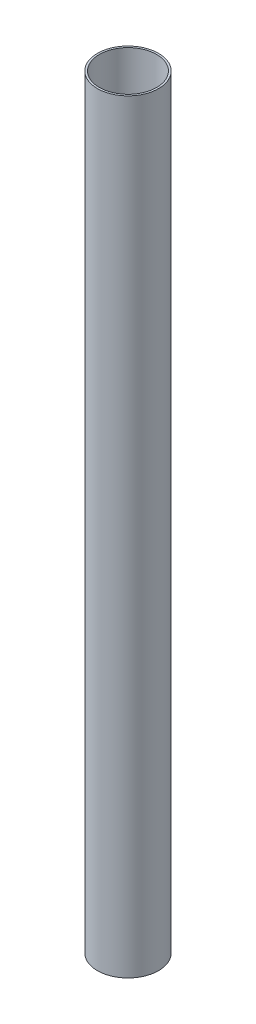
ISO-10303-21;
HEADER;
FILE_DESCRIPTION(('STEP AP214'),'2;1');
FILE_NAME('part.step','',(''),(''),'','','');
FILE_SCHEMA(('AUTOMOTIVE_DESIGN { 1 0 10303 214 1 1 1 1 }'));
ENDSEC;
DATA;
#1=APPLICATION_CONTEXT('core data for automotive mechanical design processes');
#2=APPLICATION_PROTOCOL_DEFINITION('international standard','automotive_design',2000,#1);
#3=PRODUCT_CONTEXT('',#1,'mechanical');
#4=PRODUCT('Part','Part','',(#3));
#5=PRODUCT_RELATED_PRODUCT_CATEGORY('part','',(#4));
#6=PRODUCT_DEFINITION_FORMATION('','',#4);
#7=PRODUCT_DEFINITION_CONTEXT('part definition',#1,'design');
#8=PRODUCT_DEFINITION('design','',#6,#7);
#9=PRODUCT_DEFINITION_SHAPE('','',#8);
#10=(LENGTH_UNIT() NAMED_UNIT(*) SI_UNIT(.MILLI.,.METRE.));
#11=(NAMED_UNIT(*) PLANE_ANGLE_UNIT() SI_UNIT($,.RADIAN.));
#12=(NAMED_UNIT(*) SI_UNIT($,.STERADIAN.) SOLID_ANGLE_UNIT());
#13=UNCERTAINTY_MEASURE_WITH_UNIT(LENGTH_MEASURE(1.E-05),#10,'distance_accuracy_value','');
#14=(GEOMETRIC_REPRESENTATION_CONTEXT(3) GLOBAL_UNCERTAINTY_ASSIGNED_CONTEXT((#13)) GLOBAL_UNIT_ASSIGNED_CONTEXT((#10,
#11,#12)) REPRESENTATION_CONTEXT('',''));
#15=CARTESIAN_POINT('',(0.,0.,0.));
#16=DIRECTION('',(0.,0.,1.));
#17=DIRECTION('',(1.,0.,0.));
#18=AXIS2_PLACEMENT_3D('',#15,#16,#17);
#19=CARTESIAN_POINT('',(0.,200.,0.));
#20=DIRECTION('',(0.,1.,0.));
#21=DIRECTION('',(0.,0.,1.));
#22=AXIS2_PLACEMENT_3D('',#19,#20,#21);
#23=PLANE('',#22);
#24=CARTESIAN_POINT('',(0.,200.,0.));
#25=DIRECTION('',(0.,1.,0.));
#26=DIRECTION('',(0.,0.,1.));
#27=AXIS2_PLACEMENT_3D('',#24,#25,#26);
#28=CIRCLE('',#27,8.);
#29=CARTESIAN_POINT('',(0.,200.,8.));
#30=VERTEX_POINT('',#29);
#31=EDGE_CURVE('E10',#30,#30,#28,.T.);
#32=ORIENTED_EDGE('',*,*,#31,.T.);
#33=EDGE_LOOP('',(#32));
#34=FACE_BOUND('',#33,.T.);
#35=CARTESIAN_POINT('',(0.,200.,0.));
#36=DIRECTION('',(0.,1.,0.));
#37=DIRECTION('',(0.,0.,1.));
#38=AXIS2_PLACEMENT_3D('',#35,#36,#37);
#39=CIRCLE('',#38,7.5);
#40=CARTESIAN_POINT('',(0.,200.,7.5));
#41=VERTEX_POINT('',#40);
#42=EDGE_CURVE('E50',#41,#41,#39,.T.);
#43=ORIENTED_EDGE('',*,*,#42,.F.);
#44=EDGE_LOOP('',(#43));
#45=FACE_BOUND('',#44,.T.);
#46=ADVANCED_FACE('F39',(#34,#45),#23,.T.);
#47=CARTESIAN_POINT('',(0.,0.,0.));
#48=DIRECTION('',(0.,1.,0.));
#49=DIRECTION('',(0.,0.,1.));
#50=AXIS2_PLACEMENT_3D('',#47,#48,#49);
#51=PLANE('',#50);
#52=CARTESIAN_POINT('',(0.,0.,0.));
#53=DIRECTION('',(0.,1.,0.));
#54=DIRECTION('',(0.,0.,1.));
#55=AXIS2_PLACEMENT_3D('',#52,#53,#54);
#56=CIRCLE('',#55,8.);
#57=CARTESIAN_POINT('',(0.,0.,8.));
#58=VERTEX_POINT('',#57);
#59=EDGE_CURVE('E43',#58,#58,#56,.T.);
#60=ORIENTED_EDGE('',*,*,#59,.F.);
#61=EDGE_LOOP('',(#60));
#62=FACE_BOUND('',#61,.T.);
#63=CARTESIAN_POINT('',(0.,0.,0.));
#64=DIRECTION('',(0.,1.,0.));
#65=DIRECTION('',(0.,0.,1.));
#66=AXIS2_PLACEMENT_3D('',#63,#64,#65);
#67=CIRCLE('',#66,7.5);
#68=CARTESIAN_POINT('',(0.,0.,7.5));
#69=VERTEX_POINT('',#68);
#70=EDGE_CURVE('E52',#69,#69,#67,.T.);
#71=ORIENTED_EDGE('',*,*,#70,.T.);
#72=EDGE_LOOP('',(#71));
#73=FACE_BOUND('',#72,.T.);
#74=ADVANCED_FACE('F62',(#62,#73),#51,.F.);
#75=CARTESIAN_POINT('',(0.,200.,0.));
#76=DIRECTION('',(0.,-1.,0.));
#77=DIRECTION('',(0.,0.,-1.));
#78=AXIS2_PLACEMENT_3D('',#75,#76,#77);
#79=CYLINDRICAL_SURFACE('',#78,8.);
#80=ORIENTED_EDGE('',*,*,#31,.F.);
#81=EDGE_LOOP('',(#80));
#82=FACE_BOUND('',#81,.T.);
#83=ORIENTED_EDGE('',*,*,#59,.T.);
#84=EDGE_LOOP('',(#83));
#85=FACE_BOUND('',#84,.T.);
#86=ADVANCED_FACE('F41',(#82,#85),#79,.T.);
#87=CARTESIAN_POINT('',(0.,200.,0.));
#88=DIRECTION('',(0.,-1.,0.));
#89=DIRECTION('',(0.,0.,-1.));
#90=AXIS2_PLACEMENT_3D('',#87,#88,#89);
#91=CYLINDRICAL_SURFACE('',#90,7.5);
#92=ORIENTED_EDGE('',*,*,#42,.T.);
#93=EDGE_LOOP('',(#92));
#94=FACE_BOUND('',#93,.T.);
#95=ORIENTED_EDGE('',*,*,#70,.F.);
#96=EDGE_LOOP('',(#95));
#97=FACE_BOUND('',#96,.T.);
#98=ADVANCED_FACE('F58',(#94,#97),#91,.F.);
#99=CLOSED_SHELL('',(#46,#74,#86,#98));
#100=MANIFOLD_SOLID_BREP('B2',#99);
#101=ADVANCED_BREP_SHAPE_REPRESENTATION('',(#18,#100),#14);
#102=SHAPE_DEFINITION_REPRESENTATION(#9,#101);
ENDSEC;
END-ISO-10303-21;
